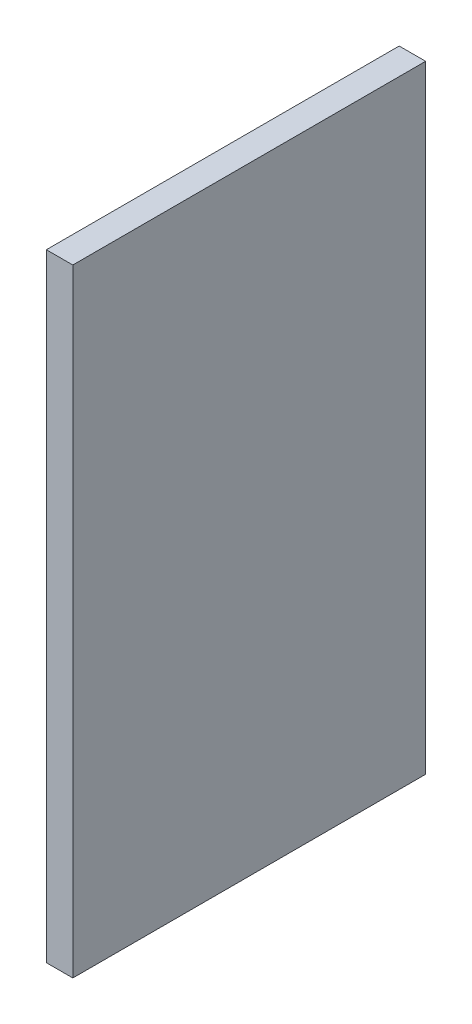
ISO-10303-21;
HEADER;
FILE_DESCRIPTION(('STEP AP214'),'2;1');
FILE_NAME('part.step','',(''),(''),'','','');
FILE_SCHEMA(('AUTOMOTIVE_DESIGN { 1 0 10303 214 1 1 1 1 }'));
ENDSEC;
DATA;
#1=APPLICATION_CONTEXT('core data for automotive mechanical design processes');
#2=APPLICATION_PROTOCOL_DEFINITION('international standard','automotive_design',2000,#1);
#3=PRODUCT_CONTEXT('',#1,'mechanical');
#4=PRODUCT('Part','Part','',(#3));
#5=PRODUCT_RELATED_PRODUCT_CATEGORY('part','',(#4));
#6=PRODUCT_DEFINITION_FORMATION('','',#4);
#7=PRODUCT_DEFINITION_CONTEXT('part definition',#1,'design');
#8=PRODUCT_DEFINITION('design','',#6,#7);
#9=PRODUCT_DEFINITION_SHAPE('','',#8);
#10=(LENGTH_UNIT() NAMED_UNIT(*) SI_UNIT(.MILLI.,.METRE.));
#11=(NAMED_UNIT(*) PLANE_ANGLE_UNIT() SI_UNIT($,.RADIAN.));
#12=(NAMED_UNIT(*) SI_UNIT($,.STERADIAN.) SOLID_ANGLE_UNIT());
#13=UNCERTAINTY_MEASURE_WITH_UNIT(LENGTH_MEASURE(1.E-05),#10,'distance_accuracy_value','');
#14=(GEOMETRIC_REPRESENTATION_CONTEXT(3) GLOBAL_UNCERTAINTY_ASSIGNED_CONTEXT((#13)) GLOBAL_UNIT_ASSIGNED_CONTEXT((#10,
#11,#12)) REPRESENTATION_CONTEXT('',''));
#15=CARTESIAN_POINT('',(0.,0.,0.));
#16=DIRECTION('',(0.,0.,1.));
#17=DIRECTION('',(1.,0.,0.));
#18=AXIS2_PLACEMENT_3D('',#15,#16,#17);
#19=CARTESIAN_POINT('',(0.,0.,160.));
#20=DIRECTION('',(0.,0.,1.));
#21=DIRECTION('',(1.,0.,0.));
#22=AXIS2_PLACEMENT_3D('',#19,#20,#21);
#23=PLANE('',#22);
#24=DIRECTION('',(0.,1.,0.));
#25=VECTOR('',#24,1.);
#26=CARTESIAN_POINT('',(0.,0.,160.));
#27=LINE('',#26,#25);
#28=CARTESIAN_POINT('',(0.,0.,160.));
#29=VERTEX_POINT('',#28);
#30=CARTESIAN_POINT('',(0.,280.,160.));
#31=VERTEX_POINT('',#30);
#32=EDGE_CURVE('E87',#29,#31,#27,.T.);
#33=ORIENTED_EDGE('',*,*,#32,.F.);
#34=DIRECTION('',(1.,0.,0.));
#35=VECTOR('',#34,1.);
#36=CARTESIAN_POINT('',(0.,0.,160.));
#37=LINE('',#36,#35);
#38=CARTESIAN_POINT('',(12.,0.,160.));
#39=VERTEX_POINT('',#38);
#40=EDGE_CURVE('E75',#29,#39,#37,.T.);
#41=ORIENTED_EDGE('',*,*,#40,.T.);
#42=DIRECTION('',(0.,1.,0.));
#43=VECTOR('',#42,1.);
#44=CARTESIAN_POINT('',(12.,0.,160.));
#45=LINE('',#44,#43);
#46=CARTESIAN_POINT('',(12.,280.,160.));
#47=VERTEX_POINT('',#46);
#48=EDGE_CURVE('E85',#39,#47,#45,.T.);
#49=ORIENTED_EDGE('',*,*,#48,.T.);
#50=DIRECTION('',(1.,0.,0.));
#51=VECTOR('',#50,1.);
#52=CARTESIAN_POINT('',(0.,280.,160.));
#53=LINE('',#52,#51);
#54=EDGE_CURVE('E10',#31,#47,#53,.T.);
#55=ORIENTED_EDGE('',*,*,#54,.F.);
#56=EDGE_LOOP('',(#33,#41,#49,#55));
#57=FACE_BOUND('',#56,.T.);
#58=ADVANCED_FACE('F16',(#57),#23,.T.);
#59=CARTESIAN_POINT('',(0.,0.,0.));
#60=DIRECTION('',(0.,0.,1.));
#61=DIRECTION('',(1.,0.,0.));
#62=AXIS2_PLACEMENT_3D('',#59,#60,#61);
#63=PLANE('',#62);
#64=DIRECTION('',(1.,0.,0.));
#65=VECTOR('',#64,1.);
#66=CARTESIAN_POINT('',(0.,280.,0.));
#67=LINE('',#66,#65);
#68=CARTESIAN_POINT('',(0.,280.,0.));
#69=VERTEX_POINT('',#68);
#70=CARTESIAN_POINT('',(12.,280.,0.));
#71=VERTEX_POINT('',#70);
#72=EDGE_CURVE('E25',#69,#71,#67,.T.);
#73=ORIENTED_EDGE('',*,*,#72,.T.);
#74=DIRECTION('',(0.,1.,0.));
#75=VECTOR('',#74,1.);
#76=CARTESIAN_POINT('',(12.,0.,0.));
#77=LINE('',#76,#75);
#78=CARTESIAN_POINT('',(12.,0.,0.));
#79=VERTEX_POINT('',#78);
#80=EDGE_CURVE('E102',#79,#71,#77,.T.);
#81=ORIENTED_EDGE('',*,*,#80,.F.);
#82=DIRECTION('',(1.,0.,0.));
#83=VECTOR('',#82,1.);
#84=CARTESIAN_POINT('',(0.,0.,0.));
#85=LINE('',#84,#83);
#86=CARTESIAN_POINT('',(0.,0.,0.));
#87=VERTEX_POINT('',#86);
#88=EDGE_CURVE('E19',#87,#79,#85,.T.);
#89=ORIENTED_EDGE('',*,*,#88,.F.);
#90=DIRECTION('',(0.,1.,0.));
#91=VECTOR('',#90,1.);
#92=CARTESIAN_POINT('',(0.,0.,0.));
#93=LINE('',#92,#91);
#94=EDGE_CURVE('E86',#87,#69,#93,.T.);
#95=ORIENTED_EDGE('',*,*,#94,.T.);
#96=EDGE_LOOP('',(#73,#81,#89,#95));
#97=FACE_BOUND('',#96,.T.);
#98=ADVANCED_FACE('F117',(#97),#63,.F.);
#99=CARTESIAN_POINT('',(0.,280.,0.));
#100=DIRECTION('',(0.,1.,0.));
#101=DIRECTION('',(1.,0.,0.));
#102=AXIS2_PLACEMENT_3D('',#99,#100,#101);
#103=PLANE('',#102);
#104=ORIENTED_EDGE('',*,*,#72,.F.);
#105=DIRECTION('',(0.,0.,1.));
#106=VECTOR('',#105,1.);
#107=CARTESIAN_POINT('',(0.,280.,0.));
#108=LINE('',#107,#106);
#109=EDGE_CURVE('E95',#69,#31,#108,.T.);
#110=ORIENTED_EDGE('',*,*,#109,.T.);
#111=ORIENTED_EDGE('',*,*,#54,.T.);
#112=DIRECTION('',(0.,0.,1.));
#113=VECTOR('',#112,1.);
#114=CARTESIAN_POINT('',(12.,280.,0.));
#115=LINE('',#114,#113);
#116=EDGE_CURVE('E104',#71,#47,#115,.T.);
#117=ORIENTED_EDGE('',*,*,#116,.F.);
#118=EDGE_LOOP('',(#104,#110,#111,#117));
#119=FACE_BOUND('',#118,.T.);
#120=ADVANCED_FACE('F116',(#119),#103,.T.);
#121=CARTESIAN_POINT('',(0.,0.,0.));
#122=DIRECTION('',(0.,1.,0.));
#123=DIRECTION('',(1.,0.,0.));
#124=AXIS2_PLACEMENT_3D('',#121,#122,#123);
#125=PLANE('',#124);
#126=DIRECTION('',(0.,0.,1.));
#127=VECTOR('',#126,1.);
#128=CARTESIAN_POINT('',(12.,0.,0.));
#129=LINE('',#128,#127);
#130=EDGE_CURVE('E80',#79,#39,#129,.T.);
#131=ORIENTED_EDGE('',*,*,#130,.T.);
#132=ORIENTED_EDGE('',*,*,#40,.F.);
#133=DIRECTION('',(0.,0.,1.));
#134=VECTOR('',#133,1.);
#135=CARTESIAN_POINT('',(0.,0.,0.));
#136=LINE('',#135,#134);
#137=EDGE_CURVE('E72',#87,#29,#136,.T.);
#138=ORIENTED_EDGE('',*,*,#137,.F.);
#139=ORIENTED_EDGE('',*,*,#88,.T.);
#140=EDGE_LOOP('',(#131,#132,#138,#139));
#141=FACE_BOUND('',#140,.T.);
#142=ADVANCED_FACE('F73',(#141),#125,.F.);
#143=CARTESIAN_POINT('',(12.,0.,0.));
#144=DIRECTION('',(1.,0.,0.));
#145=DIRECTION('',(0.,1.,0.));
#146=AXIS2_PLACEMENT_3D('',#143,#144,#145);
#147=PLANE('',#146);
#148=ORIENTED_EDGE('',*,*,#130,.F.);
#149=ORIENTED_EDGE('',*,*,#80,.T.);
#150=ORIENTED_EDGE('',*,*,#116,.T.);
#151=ORIENTED_EDGE('',*,*,#48,.F.);
#152=EDGE_LOOP('',(#148,#149,#150,#151));
#153=FACE_BOUND('',#152,.T.);
#154=ADVANCED_FACE('F113',(#153),#147,.T.);
#155=CARTESIAN_POINT('',(0.,0.,0.));
#156=DIRECTION('',(1.,0.,0.));
#157=DIRECTION('',(0.,1.,0.));
#158=AXIS2_PLACEMENT_3D('',#155,#156,#157);
#159=PLANE('',#158);
#160=ORIENTED_EDGE('',*,*,#32,.T.);
#161=ORIENTED_EDGE('',*,*,#109,.F.);
#162=ORIENTED_EDGE('',*,*,#94,.F.);
#163=ORIENTED_EDGE('',*,*,#137,.T.);
#164=EDGE_LOOP('',(#160,#161,#162,#163));
#165=FACE_BOUND('',#164,.T.);
#166=ADVANCED_FACE('F84',(#165),#159,.F.);
#167=CLOSED_SHELL('',(#58,#98,#120,#142,#154,#166));
#168=MANIFOLD_SOLID_BREP('B1',#167);
#169=ADVANCED_BREP_SHAPE_REPRESENTATION('',(#18,#168),#14);
#170=SHAPE_DEFINITION_REPRESENTATION(#9,#169);
ENDSEC;
END-ISO-10303-21;
